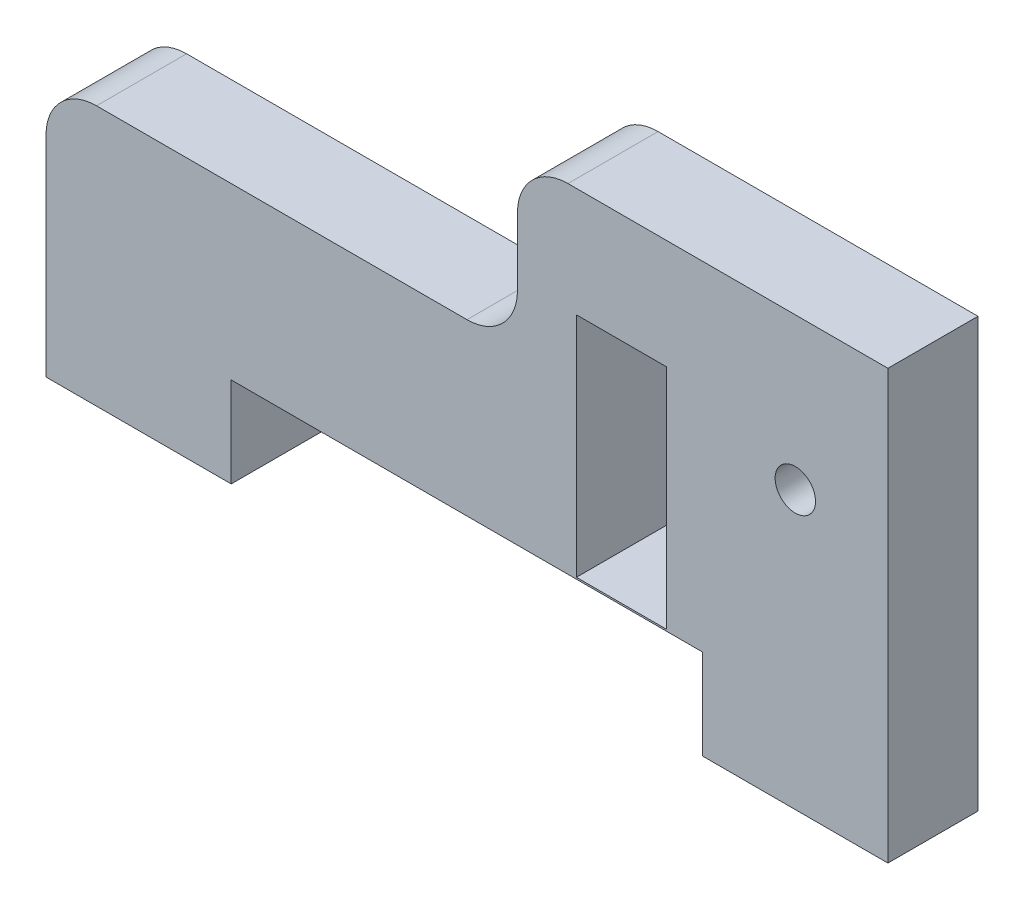
ISO-10303-21;
HEADER;
FILE_DESCRIPTION(('STEP AP214'),'2;1');
FILE_NAME('part.step','',(''),(''),'','','');
FILE_SCHEMA(('AUTOMOTIVE_DESIGN { 1 0 10303 214 1 1 1 1 }'));
ENDSEC;
DATA;
#1=APPLICATION_CONTEXT('core data for automotive mechanical design processes');
#2=APPLICATION_PROTOCOL_DEFINITION('international standard','automotive_design',2000,#1);
#3=PRODUCT_CONTEXT('',#1,'mechanical');
#4=PRODUCT('Part','Part','',(#3));
#5=PRODUCT_RELATED_PRODUCT_CATEGORY('part','',(#4));
#6=PRODUCT_DEFINITION_FORMATION('','',#4);
#7=PRODUCT_DEFINITION_CONTEXT('part definition',#1,'design');
#8=PRODUCT_DEFINITION('design','',#6,#7);
#9=PRODUCT_DEFINITION_SHAPE('','',#8);
#10=(LENGTH_UNIT() NAMED_UNIT(*) SI_UNIT(.MILLI.,.METRE.));
#11=(NAMED_UNIT(*) PLANE_ANGLE_UNIT() SI_UNIT($,.RADIAN.));
#12=(NAMED_UNIT(*) SI_UNIT($,.STERADIAN.) SOLID_ANGLE_UNIT());
#13=UNCERTAINTY_MEASURE_WITH_UNIT(LENGTH_MEASURE(1.E-05),#10,'distance_accuracy_value','');
#14=(GEOMETRIC_REPRESENTATION_CONTEXT(3) GLOBAL_UNCERTAINTY_ASSIGNED_CONTEXT((#13)) GLOBAL_UNIT_ASSIGNED_CONTEXT((#10,
#11,#12)) REPRESENTATION_CONTEXT('',''));
#15=CARTESIAN_POINT('',(0.,0.,0.));
#16=DIRECTION('',(0.,0.,1.));
#17=DIRECTION('',(1.,0.,0.));
#18=AXIS2_PLACEMENT_3D('',#15,#16,#17);
#19=CARTESIAN_POINT('',(3.,12.4499998316,5.35));
#20=DIRECTION('',(0.,0.,1.));
#21=DIRECTION('',(1.,0.,0.));
#22=AXIS2_PLACEMENT_3D('',#19,#20,#21);
#23=PLANE('',#22);
#24=CARTESIAN_POINT('',(3.,12.4499998316,5.35));
#25=DIRECTION('',(0.,0.,1.));
#26=DIRECTION('',(1.,0.,0.));
#27=AXIS2_PLACEMENT_3D('',#24,#25,#26);
#28=CIRCLE('',#27,3.00000000000001);
#29=CARTESIAN_POINT('',(3.00000002609999,15.4499998316,5.35));
#30=VERTEX_POINT('',#29);
#31=CARTESIAN_POINT('',(0.,12.4499998316,5.35));
#32=VERTEX_POINT('',#31);
#33=EDGE_CURVE('E194',#30,#32,#28,.T.);
#34=ORIENTED_EDGE('',*,*,#33,.T.);
#35=DIRECTION('',(0.,-1.,0.));
#36=VECTOR('',#35,1.);
#37=CARTESIAN_POINT('',(0.,12.4499998316,5.35));
#38=LINE('',#37,#36);
#39=CARTESIAN_POINT('',(0.,0.,5.35));
#40=VERTEX_POINT('',#39);
#41=EDGE_CURVE('E197',#32,#40,#38,.T.);
#42=ORIENTED_EDGE('',*,*,#41,.T.);
#43=DIRECTION('',(1.,0.,0.));
#44=VECTOR('',#43,1.);
#45=CARTESIAN_POINT('',(0.,0.,5.35));
#46=LINE('',#45,#44);
#47=CARTESIAN_POINT('',(10.9999999404,0.,5.35));
#48=VERTEX_POINT('',#47);
#49=EDGE_CURVE('E200',#40,#48,#46,.T.);
#50=ORIENTED_EDGE('',*,*,#49,.T.);
#51=DIRECTION('',(0.,1.,0.));
#52=VECTOR('',#51,1.);
#53=CARTESIAN_POINT('',(10.9999999404,0.,5.35));
#54=LINE('',#53,#52);
#55=CARTESIAN_POINT('',(10.9999999404,5.350000225,5.35));
#56=VERTEX_POINT('',#55);
#57=EDGE_CURVE('E202',#48,#56,#54,.T.);
#58=ORIENTED_EDGE('',*,*,#57,.T.);
#59=DIRECTION('',(1.,0.,0.));
#60=VECTOR('',#59,1.);
#61=CARTESIAN_POINT('',(10.9999999404,5.350000225,5.35));
#62=LINE('',#61,#60);
#63=CARTESIAN_POINT('',(39.0000008047,5.350000225,5.35));
#64=VERTEX_POINT('',#63);
#65=EDGE_CURVE('E204',#56,#64,#62,.T.);
#66=ORIENTED_EDGE('',*,*,#65,.T.);
#67=DIRECTION('',(0.,-1.,0.));
#68=VECTOR('',#67,1.);
#69=CARTESIAN_POINT('',(39.0000008047,5.350000225,5.35));
#70=LINE('',#69,#68);
#71=CARTESIAN_POINT('',(39.0000008047,0.,5.35));
#72=VERTEX_POINT('',#71);
#73=EDGE_CURVE('E206',#64,#72,#70,.T.);
#74=ORIENTED_EDGE('',*,*,#73,.T.);
#75=DIRECTION('',(1.,0.,0.));
#76=VECTOR('',#75,1.);
#77=CARTESIAN_POINT('',(39.0000008047,0.,5.35));
#78=LINE('',#77,#76);
#79=CARTESIAN_POINT('',(50.0000007451,0.,5.35));
#80=VERTEX_POINT('',#79);
#81=EDGE_CURVE('E208',#72,#80,#78,.T.);
#82=ORIENTED_EDGE('',*,*,#81,.T.);
#83=DIRECTION('',(0.,1.,0.));
#84=VECTOR('',#83,1.);
#85=CARTESIAN_POINT('',(50.0000007451,0.,5.35));
#86=LINE('',#85,#84);
#87=CARTESIAN_POINT('',(50.0000007451,25.4500005395,5.35));
#88=VERTEX_POINT('',#87);
#89=EDGE_CURVE('E210',#80,#88,#86,.T.);
#90=ORIENTED_EDGE('',*,*,#89,.T.);
#91=DIRECTION('',(-1.,0.,0.));
#92=VECTOR('',#91,1.);
#93=CARTESIAN_POINT('',(50.0000007451,25.4500005395,5.35));
#94=LINE('',#93,#92);
#95=CARTESIAN_POINT('',(30.9999994934,25.4500005395,5.35));
#96=VERTEX_POINT('',#95);
#97=EDGE_CURVE('E212',#88,#96,#94,.T.);
#98=ORIENTED_EDGE('',*,*,#97,.T.);
#99=CARTESIAN_POINT('',(31.0000008642999,22.4500005395003,5.35));
#100=DIRECTION('',(0.,0.,1.));
#101=DIRECTION('',(1.,0.,0.));
#102=AXIS2_PLACEMENT_3D('',#99,#100,#101);
#103=CIRCLE('',#102,2.99999999999997);
#104=CARTESIAN_POINT('',(28.0000008643,22.4500005395003,5.35));
#105=VERTEX_POINT('',#104);
#106=EDGE_CURVE('E214',#96,#105,#103,.T.);
#107=ORIENTED_EDGE('',*,*,#106,.T.);
#108=DIRECTION('',(0.,-1.,0.));
#109=VECTOR('',#108,1.);
#110=CARTESIAN_POINT('',(28.0000008643,18.4499998316,5.35));
#111=LINE('',#110,#109);
#112=CARTESIAN_POINT('',(28.0000008643,18.4499998316,5.35));
#113=VERTEX_POINT('',#112);
#114=EDGE_CURVE('E216',#105,#113,#111,.T.);
#115=ORIENTED_EDGE('',*,*,#114,.T.);
#116=CARTESIAN_POINT('',(25.0000008643,18.4499998316,5.35));
#117=DIRECTION('',(0.,0.,-1.));
#118=DIRECTION('',(1.,0.,0.));
#119=AXIS2_PLACEMENT_3D('',#116,#117,#118);
#120=CIRCLE('',#119,2.99999999999999);
#121=CARTESIAN_POINT('',(25.0000003726,15.4499998316,5.35));
#122=VERTEX_POINT('',#121);
#123=EDGE_CURVE('E218',#113,#122,#120,.T.);
#124=ORIENTED_EDGE('',*,*,#123,.T.);
#125=DIRECTION('',(-1.,0.,0.));
#126=VECTOR('',#125,1.);
#127=CARTESIAN_POINT('',(3.00000002609999,15.4499998316,5.35));
#128=LINE('',#127,#126);
#129=EDGE_CURVE('E220',#122,#30,#128,.T.);
#130=ORIENTED_EDGE('',*,*,#129,.T.);
#131=EDGE_LOOP('',(#34,#42,#50,#58,#66,#74,#82,#90,#98,#107,#115,#124,#130));
#132=FACE_BOUND('',#131,.T.);
#133=CARTESIAN_POINT('',(44.5,16.45,5.35));
#134=DIRECTION('',(0.,0.,1.));
#135=DIRECTION('',(1.,0.,0.));
#136=AXIS2_PLACEMENT_3D('',#133,#134,#135);
#137=CIRCLE('',#136,1.19999999999998);
#138=CARTESIAN_POINT('',(45.7,16.45,5.35));
#139=VERTEX_POINT('',#138);
#140=EDGE_CURVE('E188',#139,#139,#137,.T.);
#141=ORIENTED_EDGE('',*,*,#140,.F.);
#142=EDGE_LOOP('',(#141));
#143=FACE_BOUND('',#142,.T.);
#144=DIRECTION('',(0.,1.,0.));
#145=VECTOR('',#144,1.);
#146=CARTESIAN_POINT('',(36.850001663,18.9500004053,5.35));
#147=LINE('',#146,#145);
#148=CARTESIAN_POINT('',(36.850001663,5.4500000552,5.35));
#149=VERTEX_POINT('',#148);
#150=CARTESIAN_POINT('',(36.850001663,18.9500004053,5.35));
#151=VERTEX_POINT('',#150);
#152=EDGE_CURVE('E160',#149,#151,#147,.T.);
#153=ORIENTED_EDGE('',*,*,#152,.F.);
#154=DIRECTION('',(1.,0.,0.));
#155=VECTOR('',#154,1.);
#156=CARTESIAN_POINT('',(36.850001663,5.4500000552,5.35));
#157=LINE('',#156,#155);
#158=CARTESIAN_POINT('',(31.5000005067,5.4500000552,5.35));
#159=VERTEX_POINT('',#158);
#160=EDGE_CURVE('E152',#159,#149,#157,.T.);
#161=ORIENTED_EDGE('',*,*,#160,.F.);
#162=DIRECTION('',(0.,-1.,0.));
#163=VECTOR('',#162,1.);
#164=CARTESIAN_POINT('',(31.5000005067,5.4500000552,5.35));
#165=LINE('',#164,#163);
#166=CARTESIAN_POINT('',(31.5000005067,18.9500004053,5.35));
#167=VERTEX_POINT('',#166);
#168=EDGE_CURVE('E174',#167,#159,#165,.T.);
#169=ORIENTED_EDGE('',*,*,#168,.F.);
#170=DIRECTION('',(-1.,0.,0.));
#171=VECTOR('',#170,1.);
#172=CARTESIAN_POINT('',(31.5000005067,18.9500004053,5.35));
#173=LINE('',#172,#171);
#174=EDGE_CURVE('E172',#151,#167,#173,.T.);
#175=ORIENTED_EDGE('',*,*,#174,.F.);
#176=EDGE_LOOP('',(#153,#161,#169,#175));
#177=FACE_BOUND('',#176,.T.);
#178=ADVANCED_FACE('F33',(#132,#143,#177),#23,.T.);
#179=CARTESIAN_POINT('',(3.,12.4499998316,0.));
#180=DIRECTION('',(0.,0.,1.));
#181=DIRECTION('',(1.,0.,0.));
#182=AXIS2_PLACEMENT_3D('',#179,#180,#181);
#183=PLANE('',#182);
#184=CARTESIAN_POINT('',(44.5,16.45,0.));
#185=DIRECTION('',(0.,0.,1.));
#186=DIRECTION('',(1.,0.,0.));
#187=AXIS2_PLACEMENT_3D('',#184,#185,#186);
#188=CIRCLE('',#187,1.19999999999998);
#189=CARTESIAN_POINT('',(45.7,16.45,0.));
#190=VERTEX_POINT('',#189);
#191=EDGE_CURVE('E168',#190,#190,#188,.T.);
#192=ORIENTED_EDGE('',*,*,#191,.T.);
#193=EDGE_LOOP('',(#192));
#194=FACE_BOUND('',#193,.T.);
#195=CARTESIAN_POINT('',(3.,12.4499998316,0.));
#196=DIRECTION('',(0.,0.,1.));
#197=DIRECTION('',(1.,0.,0.));
#198=AXIS2_PLACEMENT_3D('',#195,#196,#197);
#199=CIRCLE('',#198,3.00000000000001);
#200=CARTESIAN_POINT('',(3.00000002609999,15.4499998316,0.));
#201=VERTEX_POINT('',#200);
#202=CARTESIAN_POINT('',(0.,12.4499998316,0.));
#203=VERTEX_POINT('',#202);
#204=EDGE_CURVE('E191',#201,#203,#199,.T.);
#205=ORIENTED_EDGE('',*,*,#204,.F.);
#206=DIRECTION('',(-1.,0.,0.));
#207=VECTOR('',#206,1.);
#208=CARTESIAN_POINT('',(3.00000002609999,15.4499998316,0.));
#209=LINE('',#208,#207);
#210=CARTESIAN_POINT('',(25.0000003726,15.4499998316,0.));
#211=VERTEX_POINT('',#210);
#212=EDGE_CURVE('E198',#211,#201,#209,.T.);
#213=ORIENTED_EDGE('',*,*,#212,.F.);
#214=CARTESIAN_POINT('',(25.0000008643,18.4499998316,0.));
#215=DIRECTION('',(0.,0.,-1.));
#216=DIRECTION('',(1.,0.,0.));
#217=AXIS2_PLACEMENT_3D('',#214,#215,#216);
#218=CIRCLE('',#217,2.99999999999999);
#219=CARTESIAN_POINT('',(28.0000008643,18.4499998316,0.));
#220=VERTEX_POINT('',#219);
#221=EDGE_CURVE('E245',#220,#211,#218,.T.);
#222=ORIENTED_EDGE('',*,*,#221,.F.);
#223=DIRECTION('',(0.,-1.,0.));
#224=VECTOR('',#223,1.);
#225=CARTESIAN_POINT('',(28.0000008643,18.4499998316,0.));
#226=LINE('',#225,#224);
#227=CARTESIAN_POINT('',(28.0000008643,22.4500005395003,0.));
#228=VERTEX_POINT('',#227);
#229=EDGE_CURVE('E243',#228,#220,#226,.T.);
#230=ORIENTED_EDGE('',*,*,#229,.F.);
#231=CARTESIAN_POINT('',(31.0000008642999,22.4500005395003,0.));
#232=DIRECTION('',(0.,0.,1.));
#233=DIRECTION('',(1.,0.,0.));
#234=AXIS2_PLACEMENT_3D('',#231,#232,#233);
#235=CIRCLE('',#234,2.99999999999997);
#236=CARTESIAN_POINT('',(30.9999994934,25.4500005395,0.));
#237=VERTEX_POINT('',#236);
#238=EDGE_CURVE('E241',#237,#228,#235,.T.);
#239=ORIENTED_EDGE('',*,*,#238,.F.);
#240=DIRECTION('',(-1.,0.,0.));
#241=VECTOR('',#240,1.);
#242=CARTESIAN_POINT('',(50.0000007451,25.4500005395,0.));
#243=LINE('',#242,#241);
#244=CARTESIAN_POINT('',(50.0000007451,25.4500005395,0.));
#245=VERTEX_POINT('',#244);
#246=EDGE_CURVE('E239',#245,#237,#243,.T.);
#247=ORIENTED_EDGE('',*,*,#246,.F.);
#248=DIRECTION('',(0.,1.,0.));
#249=VECTOR('',#248,1.);
#250=CARTESIAN_POINT('',(50.0000007451,0.,0.));
#251=LINE('',#250,#249);
#252=CARTESIAN_POINT('',(50.0000007451,0.,0.));
#253=VERTEX_POINT('',#252);
#254=EDGE_CURVE('E237',#253,#245,#251,.T.);
#255=ORIENTED_EDGE('',*,*,#254,.F.);
#256=DIRECTION('',(1.,0.,0.));
#257=VECTOR('',#256,1.);
#258=CARTESIAN_POINT('',(39.0000008047,0.,0.));
#259=LINE('',#258,#257);
#260=CARTESIAN_POINT('',(39.0000008047,0.,0.));
#261=VERTEX_POINT('',#260);
#262=EDGE_CURVE('E235',#261,#253,#259,.T.);
#263=ORIENTED_EDGE('',*,*,#262,.F.);
#264=DIRECTION('',(0.,-1.,0.));
#265=VECTOR('',#264,1.);
#266=CARTESIAN_POINT('',(39.0000008047,5.350000225,0.));
#267=LINE('',#266,#265);
#268=CARTESIAN_POINT('',(39.0000008047,5.350000225,0.));
#269=VERTEX_POINT('',#268);
#270=EDGE_CURVE('E233',#269,#261,#267,.T.);
#271=ORIENTED_EDGE('',*,*,#270,.F.);
#272=DIRECTION('',(1.,0.,0.));
#273=VECTOR('',#272,1.);
#274=CARTESIAN_POINT('',(10.9999999404,5.350000225,0.));
#275=LINE('',#274,#273);
#276=CARTESIAN_POINT('',(10.9999999404,5.350000225,0.));
#277=VERTEX_POINT('',#276);
#278=EDGE_CURVE('E231',#277,#269,#275,.T.);
#279=ORIENTED_EDGE('',*,*,#278,.F.);
#280=DIRECTION('',(0.,1.,0.));
#281=VECTOR('',#280,1.);
#282=CARTESIAN_POINT('',(10.9999999404,0.,0.));
#283=LINE('',#282,#281);
#284=CARTESIAN_POINT('',(10.9999999404,0.,0.));
#285=VERTEX_POINT('',#284);
#286=EDGE_CURVE('E229',#285,#277,#283,.T.);
#287=ORIENTED_EDGE('',*,*,#286,.F.);
#288=DIRECTION('',(1.,0.,0.));
#289=VECTOR('',#288,1.);
#290=CARTESIAN_POINT('',(0.,0.,0.));
#291=LINE('',#290,#289);
#292=CARTESIAN_POINT('',(0.,0.,0.));
#293=VERTEX_POINT('',#292);
#294=EDGE_CURVE('E227',#293,#285,#291,.T.);
#295=ORIENTED_EDGE('',*,*,#294,.F.);
#296=DIRECTION('',(0.,-1.,0.));
#297=VECTOR('',#296,1.);
#298=CARTESIAN_POINT('',(0.,12.4499998316,0.));
#299=LINE('',#298,#297);
#300=EDGE_CURVE('E225',#203,#293,#299,.T.);
#301=ORIENTED_EDGE('',*,*,#300,.F.);
#302=EDGE_LOOP('',(#205,#213,#222,#230,#239,#247,#255,#263,#271,#279,#287,#295,#301));
#303=FACE_BOUND('',#302,.T.);
#304=DIRECTION('',(1.,0.,0.));
#305=VECTOR('',#304,1.);
#306=CARTESIAN_POINT('',(36.850001663,5.4500000552,0.));
#307=LINE('',#306,#305);
#308=CARTESIAN_POINT('',(31.5000005067,5.4500000552,0.));
#309=VERTEX_POINT('',#308);
#310=CARTESIAN_POINT('',(36.850001663,5.4500000552,0.));
#311=VERTEX_POINT('',#310);
#312=EDGE_CURVE('E56',#309,#311,#307,.T.);
#313=ORIENTED_EDGE('',*,*,#312,.T.);
#314=DIRECTION('',(0.,1.,0.));
#315=VECTOR('',#314,1.);
#316=CARTESIAN_POINT('',(36.850001663,18.9500004053,0.));
#317=LINE('',#316,#315);
#318=CARTESIAN_POINT('',(36.850001663,18.9500004053,0.));
#319=VERTEX_POINT('',#318);
#320=EDGE_CURVE('E167',#311,#319,#317,.T.);
#321=ORIENTED_EDGE('',*,*,#320,.T.);
#322=DIRECTION('',(-1.,0.,0.));
#323=VECTOR('',#322,1.);
#324=CARTESIAN_POINT('',(31.5000005067,18.9500004053,0.));
#325=LINE('',#324,#323);
#326=CARTESIAN_POINT('',(31.5000005067,18.9500004053,0.));
#327=VERTEX_POINT('',#326);
#328=EDGE_CURVE('E180',#319,#327,#325,.T.);
#329=ORIENTED_EDGE('',*,*,#328,.T.);
#330=DIRECTION('',(0.,-1.,0.));
#331=VECTOR('',#330,1.);
#332=CARTESIAN_POINT('',(31.5000005067,5.4500000552,0.));
#333=LINE('',#332,#331);
#334=EDGE_CURVE('E161',#327,#309,#333,.T.);
#335=ORIENTED_EDGE('',*,*,#334,.T.);
#336=EDGE_LOOP('',(#313,#321,#329,#335));
#337=FACE_BOUND('',#336,.T.);
#338=ADVANCED_FACE('F290',(#194,#303,#337),#183,.F.);
#339=CARTESIAN_POINT('',(3.,12.4499998316,5.35));
#340=DIRECTION('',(0.,0.,-1.));
#341=DIRECTION('',(-1.,0.,0.));
#342=AXIS2_PLACEMENT_3D('',#339,#340,#341);
#343=CYLINDRICAL_SURFACE('',#342,3.00000000000001);
#344=ORIENTED_EDGE('',*,*,#204,.T.);
#345=DIRECTION('',(0.,0.,-1.));
#346=VECTOR('',#345,1.);
#347=CARTESIAN_POINT('',(0.,12.4499998316,5.35));
#348=LINE('',#347,#346);
#349=EDGE_CURVE('E11',#32,#203,#348,.T.);
#350=ORIENTED_EDGE('',*,*,#349,.F.);
#351=ORIENTED_EDGE('',*,*,#33,.F.);
#352=DIRECTION('',(0.,0.,-1.));
#353=VECTOR('',#352,1.);
#354=CARTESIAN_POINT('',(3.00000002609999,15.4499998316,5.35));
#355=LINE('',#354,#353);
#356=EDGE_CURVE('E222',#30,#201,#355,.T.);
#357=ORIENTED_EDGE('',*,*,#356,.T.);
#358=EDGE_LOOP('',(#344,#350,#351,#357));
#359=FACE_BOUND('',#358,.T.);
#360=ADVANCED_FACE('F35',(#359),#343,.T.);
#361=CARTESIAN_POINT('',(0.,12.4499998316,5.35));
#362=DIRECTION('',(1.,0.,0.));
#363=DIRECTION('',(0.,0.,-1.));
#364=AXIS2_PLACEMENT_3D('',#361,#362,#363);
#365=PLANE('',#364);
#366=ORIENTED_EDGE('',*,*,#300,.T.);
#367=DIRECTION('',(0.,0.,-1.));
#368=VECTOR('',#367,1.);
#369=CARTESIAN_POINT('',(0.,0.,5.35));
#370=LINE('',#369,#368);
#371=EDGE_CURVE('E41',#40,#293,#370,.T.);
#372=ORIENTED_EDGE('',*,*,#371,.F.);
#373=ORIENTED_EDGE('',*,*,#41,.F.);
#374=ORIENTED_EDGE('',*,*,#349,.T.);
#375=EDGE_LOOP('',(#366,#372,#373,#374));
#376=FACE_BOUND('',#375,.T.);
#377=ADVANCED_FACE('F308',(#376),#365,.F.);
#378=CARTESIAN_POINT('',(0.,0.,5.35));
#379=DIRECTION('',(0.,1.,0.));
#380=DIRECTION('',(0.,0.,1.));
#381=AXIS2_PLACEMENT_3D('',#378,#379,#380);
#382=PLANE('',#381);
#383=ORIENTED_EDGE('',*,*,#294,.T.);
#384=DIRECTION('',(0.,0.,-1.));
#385=VECTOR('',#384,1.);
#386=CARTESIAN_POINT('',(10.9999999404,0.,5.35));
#387=LINE('',#386,#385);
#388=EDGE_CURVE('E277',#48,#285,#387,.T.);
#389=ORIENTED_EDGE('',*,*,#388,.F.);
#390=ORIENTED_EDGE('',*,*,#49,.F.);
#391=ORIENTED_EDGE('',*,*,#371,.T.);
#392=EDGE_LOOP('',(#383,#389,#390,#391));
#393=FACE_BOUND('',#392,.T.);
#394=ADVANCED_FACE('F284',(#393),#382,.F.);
#395=CARTESIAN_POINT('',(10.9999999404,0.,5.35));
#396=DIRECTION('',(-1.,0.,0.));
#397=DIRECTION('',(0.,0.,1.));
#398=AXIS2_PLACEMENT_3D('',#395,#396,#397);
#399=PLANE('',#398);
#400=ORIENTED_EDGE('',*,*,#286,.T.);
#401=DIRECTION('',(0.,0.,-1.));
#402=VECTOR('',#401,1.);
#403=CARTESIAN_POINT('',(10.9999999404,5.350000225,5.35));
#404=LINE('',#403,#402);
#405=EDGE_CURVE('E274',#56,#277,#404,.T.);
#406=ORIENTED_EDGE('',*,*,#405,.F.);
#407=ORIENTED_EDGE('',*,*,#57,.F.);
#408=ORIENTED_EDGE('',*,*,#388,.T.);
#409=EDGE_LOOP('',(#400,#406,#407,#408));
#410=FACE_BOUND('',#409,.T.);
#411=ADVANCED_FACE('F296',(#410),#399,.F.);
#412=CARTESIAN_POINT('',(10.9999999404,5.350000225,5.35));
#413=DIRECTION('',(0.,1.,0.));
#414=DIRECTION('',(0.,0.,1.));
#415=AXIS2_PLACEMENT_3D('',#412,#413,#414);
#416=PLANE('',#415);
#417=ORIENTED_EDGE('',*,*,#278,.T.);
#418=DIRECTION('',(0.,0.,-1.));
#419=VECTOR('',#418,1.);
#420=CARTESIAN_POINT('',(39.0000008047,5.350000225,5.35));
#421=LINE('',#420,#419);
#422=EDGE_CURVE('E271',#64,#269,#421,.T.);
#423=ORIENTED_EDGE('',*,*,#422,.F.);
#424=ORIENTED_EDGE('',*,*,#65,.F.);
#425=ORIENTED_EDGE('',*,*,#405,.T.);
#426=EDGE_LOOP('',(#417,#423,#424,#425));
#427=FACE_BOUND('',#426,.T.);
#428=ADVANCED_FACE('F300',(#427),#416,.F.);
#429=CARTESIAN_POINT('',(39.0000008047,5.350000225,5.35));
#430=DIRECTION('',(1.,0.,0.));
#431=DIRECTION('',(0.,0.,-1.));
#432=AXIS2_PLACEMENT_3D('',#429,#430,#431);
#433=PLANE('',#432);
#434=ORIENTED_EDGE('',*,*,#270,.T.);
#435=DIRECTION('',(0.,0.,-1.));
#436=VECTOR('',#435,1.);
#437=CARTESIAN_POINT('',(39.0000008047,0.,5.35));
#438=LINE('',#437,#436);
#439=EDGE_CURVE('E268',#72,#261,#438,.T.);
#440=ORIENTED_EDGE('',*,*,#439,.F.);
#441=ORIENTED_EDGE('',*,*,#73,.F.);
#442=ORIENTED_EDGE('',*,*,#422,.T.);
#443=EDGE_LOOP('',(#434,#440,#441,#442));
#444=FACE_BOUND('',#443,.T.);
#445=ADVANCED_FACE('F346',(#444),#433,.F.);
#446=CARTESIAN_POINT('',(39.0000008047,0.,5.35));
#447=DIRECTION('',(0.,1.,0.));
#448=DIRECTION('',(0.,0.,1.));
#449=AXIS2_PLACEMENT_3D('',#446,#447,#448);
#450=PLANE('',#449);
#451=ORIENTED_EDGE('',*,*,#262,.T.);
#452=DIRECTION('',(0.,0.,-1.));
#453=VECTOR('',#452,1.);
#454=CARTESIAN_POINT('',(50.0000007451,0.,5.35));
#455=LINE('',#454,#453);
#456=EDGE_CURVE('E265',#80,#253,#455,.T.);
#457=ORIENTED_EDGE('',*,*,#456,.F.);
#458=ORIENTED_EDGE('',*,*,#81,.F.);
#459=ORIENTED_EDGE('',*,*,#439,.T.);
#460=EDGE_LOOP('',(#451,#457,#458,#459));
#461=FACE_BOUND('',#460,.T.);
#462=ADVANCED_FACE('F343',(#461),#450,.F.);
#463=CARTESIAN_POINT('',(50.0000007451,0.,5.35));
#464=DIRECTION('',(-1.,0.,0.));
#465=DIRECTION('',(0.,0.,1.));
#466=AXIS2_PLACEMENT_3D('',#463,#464,#465);
#467=PLANE('',#466);
#468=ORIENTED_EDGE('',*,*,#254,.T.);
#469=DIRECTION('',(0.,0.,-1.));
#470=VECTOR('',#469,1.);
#471=CARTESIAN_POINT('',(50.0000007451,25.4500005395,5.35));
#472=LINE('',#471,#470);
#473=EDGE_CURVE('E262',#88,#245,#472,.T.);
#474=ORIENTED_EDGE('',*,*,#473,.F.);
#475=ORIENTED_EDGE('',*,*,#89,.F.);
#476=ORIENTED_EDGE('',*,*,#456,.T.);
#477=EDGE_LOOP('',(#468,#474,#475,#476));
#478=FACE_BOUND('',#477,.T.);
#479=ADVANCED_FACE('F339',(#478),#467,.F.);
#480=CARTESIAN_POINT('',(50.0000007451,25.4500005395,5.35));
#481=DIRECTION('',(0.,-1.,0.));
#482=DIRECTION('',(0.,0.,-1.));
#483=AXIS2_PLACEMENT_3D('',#480,#481,#482);
#484=PLANE('',#483);
#485=ORIENTED_EDGE('',*,*,#246,.T.);
#486=DIRECTION('',(0.,0.,-1.));
#487=VECTOR('',#486,1.);
#488=CARTESIAN_POINT('',(30.9999994934,25.4500005395,5.35));
#489=LINE('',#488,#487);
#490=EDGE_CURVE('E259',#96,#237,#489,.T.);
#491=ORIENTED_EDGE('',*,*,#490,.F.);
#492=ORIENTED_EDGE('',*,*,#97,.F.);
#493=ORIENTED_EDGE('',*,*,#473,.T.);
#494=EDGE_LOOP('',(#485,#491,#492,#493));
#495=FACE_BOUND('',#494,.T.);
#496=ADVANCED_FACE('F335',(#495),#484,.F.);
#497=CARTESIAN_POINT('',(31.0000008642999,22.4500005395003,5.35));
#498=DIRECTION('',(0.,0.,-1.));
#499=DIRECTION('',(-1.,0.,0.));
#500=AXIS2_PLACEMENT_3D('',#497,#498,#499);
#501=CYLINDRICAL_SURFACE('',#500,2.99999999999997);
#502=ORIENTED_EDGE('',*,*,#238,.T.);
#503=DIRECTION('',(0.,0.,-1.));
#504=VECTOR('',#503,1.);
#505=CARTESIAN_POINT('',(28.0000008643,22.4500005395003,5.35));
#506=LINE('',#505,#504);
#507=EDGE_CURVE('E256',#105,#228,#506,.T.);
#508=ORIENTED_EDGE('',*,*,#507,.F.);
#509=ORIENTED_EDGE('',*,*,#106,.F.);
#510=ORIENTED_EDGE('',*,*,#490,.T.);
#511=EDGE_LOOP('',(#502,#508,#509,#510));
#512=FACE_BOUND('',#511,.T.);
#513=ADVANCED_FACE('F330',(#512),#501,.T.);
#514=CARTESIAN_POINT('',(28.0000008643,18.4499998316,5.35));
#515=DIRECTION('',(1.,0.,0.));
#516=DIRECTION('',(0.,0.,-1.));
#517=AXIS2_PLACEMENT_3D('',#514,#515,#516);
#518=PLANE('',#517);
#519=ORIENTED_EDGE('',*,*,#229,.T.);
#520=DIRECTION('',(0.,0.,-1.));
#521=VECTOR('',#520,1.);
#522=CARTESIAN_POINT('',(28.0000008643,18.4499998316,5.35));
#523=LINE('',#522,#521);
#524=EDGE_CURVE('E253',#113,#220,#523,.T.);
#525=ORIENTED_EDGE('',*,*,#524,.F.);
#526=ORIENTED_EDGE('',*,*,#114,.F.);
#527=ORIENTED_EDGE('',*,*,#507,.T.);
#528=EDGE_LOOP('',(#519,#525,#526,#527));
#529=FACE_BOUND('',#528,.T.);
#530=ADVANCED_FACE('F324',(#529),#518,.F.);
#531=CARTESIAN_POINT('',(25.0000008643,18.4499998316,5.35));
#532=DIRECTION('',(0.,0.,-1.));
#533=DIRECTION('',(-1.,0.,0.));
#534=AXIS2_PLACEMENT_3D('',#531,#532,#533);
#535=CYLINDRICAL_SURFACE('',#534,2.99999999999999);
#536=ORIENTED_EDGE('',*,*,#221,.T.);
#537=DIRECTION('',(0.,0.,-1.));
#538=VECTOR('',#537,1.);
#539=CARTESIAN_POINT('',(25.0000003726,15.4499998316,5.35));
#540=LINE('',#539,#538);
#541=EDGE_CURVE('E250',#122,#211,#540,.T.);
#542=ORIENTED_EDGE('',*,*,#541,.F.);
#543=ORIENTED_EDGE('',*,*,#123,.F.);
#544=ORIENTED_EDGE('',*,*,#524,.T.);
#545=EDGE_LOOP('',(#536,#542,#543,#544));
#546=FACE_BOUND('',#545,.T.);
#547=ADVANCED_FACE('F320',(#546),#535,.F.);
#548=CARTESIAN_POINT('',(3.00000002609999,15.4499998316,5.35));
#549=DIRECTION('',(0.,-1.,0.));
#550=DIRECTION('',(0.,0.,-1.));
#551=AXIS2_PLACEMENT_3D('',#548,#549,#550);
#552=PLANE('',#551);
#553=ORIENTED_EDGE('',*,*,#212,.T.);
#554=ORIENTED_EDGE('',*,*,#356,.F.);
#555=ORIENTED_EDGE('',*,*,#129,.F.);
#556=ORIENTED_EDGE('',*,*,#541,.T.);
#557=EDGE_LOOP('',(#553,#554,#555,#556));
#558=FACE_BOUND('',#557,.T.);
#559=ADVANCED_FACE('F315',(#558),#552,.F.);
#560=CARTESIAN_POINT('',(44.5,16.45,5.35));
#561=DIRECTION('',(0.,0.,-1.));
#562=DIRECTION('',(-1.,0.,0.));
#563=AXIS2_PLACEMENT_3D('',#560,#561,#562);
#564=CYLINDRICAL_SURFACE('',#563,1.19999999999998);
#565=ORIENTED_EDGE('',*,*,#140,.T.);
#566=EDGE_LOOP('',(#565));
#567=FACE_BOUND('',#566,.T.);
#568=ORIENTED_EDGE('',*,*,#191,.F.);
#569=EDGE_LOOP('',(#568));
#570=FACE_BOUND('',#569,.T.);
#571=ADVANCED_FACE('F363',(#567,#570),#564,.F.);
#572=CARTESIAN_POINT('',(36.850001663,5.4500000552,5.35));
#573=DIRECTION('',(0.,1.,0.));
#574=DIRECTION('',(0.,0.,1.));
#575=AXIS2_PLACEMENT_3D('',#572,#573,#574);
#576=PLANE('',#575);
#577=ORIENTED_EDGE('',*,*,#312,.F.);
#578=DIRECTION('',(0.,0.,-1.));
#579=VECTOR('',#578,1.);
#580=CARTESIAN_POINT('',(31.5000005067,5.4500000552,5.35));
#581=LINE('',#580,#579);
#582=EDGE_CURVE('E156',#159,#309,#581,.T.);
#583=ORIENTED_EDGE('',*,*,#582,.F.);
#584=ORIENTED_EDGE('',*,*,#160,.T.);
#585=DIRECTION('',(0.,0.,-1.));
#586=VECTOR('',#585,1.);
#587=CARTESIAN_POINT('',(36.850001663,5.4500000552,5.35));
#588=LINE('',#587,#586);
#589=EDGE_CURVE('E155',#149,#311,#588,.T.);
#590=ORIENTED_EDGE('',*,*,#589,.T.);
#591=EDGE_LOOP('',(#577,#583,#584,#590));
#592=FACE_BOUND('',#591,.T.);
#593=ADVANCED_FACE('F154',(#592),#576,.T.);
#594=CARTESIAN_POINT('',(36.850001663,18.9500004053,5.35));
#595=DIRECTION('',(-1.,0.,0.));
#596=DIRECTION('',(0.,0.,1.));
#597=AXIS2_PLACEMENT_3D('',#594,#595,#596);
#598=PLANE('',#597);
#599=ORIENTED_EDGE('',*,*,#320,.F.);
#600=ORIENTED_EDGE('',*,*,#589,.F.);
#601=ORIENTED_EDGE('',*,*,#152,.T.);
#602=DIRECTION('',(0.,0.,-1.));
#603=VECTOR('',#602,1.);
#604=CARTESIAN_POINT('',(36.850001663,18.9500004053,5.35));
#605=LINE('',#604,#603);
#606=EDGE_CURVE('E169',#151,#319,#605,.T.);
#607=ORIENTED_EDGE('',*,*,#606,.T.);
#608=EDGE_LOOP('',(#599,#600,#601,#607));
#609=FACE_BOUND('',#608,.T.);
#610=ADVANCED_FACE('F164',(#609),#598,.T.);
#611=CARTESIAN_POINT('',(31.5000005067,18.9500004053,5.35));
#612=DIRECTION('',(0.,-1.,0.));
#613=DIRECTION('',(0.,0.,-1.));
#614=AXIS2_PLACEMENT_3D('',#611,#612,#613);
#615=PLANE('',#614);
#616=ORIENTED_EDGE('',*,*,#328,.F.);
#617=ORIENTED_EDGE('',*,*,#606,.F.);
#618=ORIENTED_EDGE('',*,*,#174,.T.);
#619=DIRECTION('',(0.,0.,-1.));
#620=VECTOR('',#619,1.);
#621=CARTESIAN_POINT('',(31.5000005067,18.9500004053,5.35));
#622=LINE('',#621,#620);
#623=EDGE_CURVE('E48',#167,#327,#622,.T.);
#624=ORIENTED_EDGE('',*,*,#623,.T.);
#625=EDGE_LOOP('',(#616,#617,#618,#624));
#626=FACE_BOUND('',#625,.T.);
#627=ADVANCED_FACE('F418',(#626),#615,.T.);
#628=CARTESIAN_POINT('',(31.5000005067,5.4500000552,5.35));
#629=DIRECTION('',(1.,0.,0.));
#630=DIRECTION('',(0.,0.,-1.));
#631=AXIS2_PLACEMENT_3D('',#628,#629,#630);
#632=PLANE('',#631);
#633=ORIENTED_EDGE('',*,*,#334,.F.);
#634=ORIENTED_EDGE('',*,*,#623,.F.);
#635=ORIENTED_EDGE('',*,*,#168,.T.);
#636=ORIENTED_EDGE('',*,*,#582,.T.);
#637=EDGE_LOOP('',(#633,#634,#635,#636));
#638=FACE_BOUND('',#637,.T.);
#639=ADVANCED_FACE('F425',(#638),#632,.T.);
#640=CLOSED_SHELL('',(#178,#338,#360,#377,#394,#411,#428,#445,#462,#479,#496,#513,#530,#547,
#559,#571,#593,#610,#627,#639));
#641=MANIFOLD_SOLID_BREP('B2',#640);
#642=ADVANCED_BREP_SHAPE_REPRESENTATION('',(#18,#641),#14);
#643=SHAPE_DEFINITION_REPRESENTATION(#9,#642);
ENDSEC;
END-ISO-10303-21;
